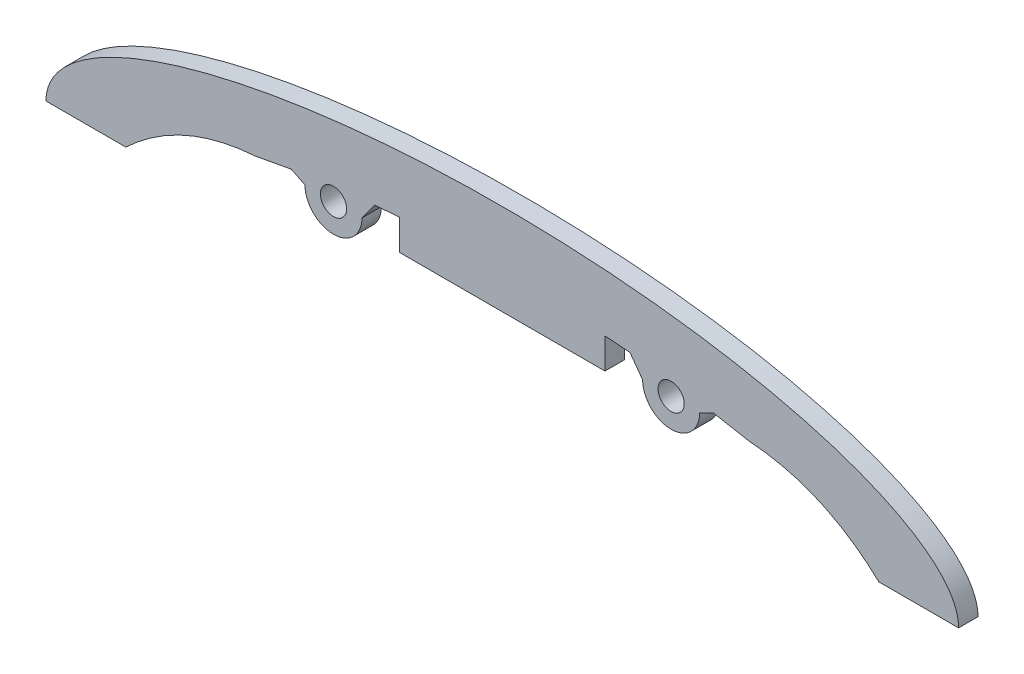
ISO-10303-21;
HEADER;
FILE_DESCRIPTION(('STEP AP214'),'2;1');
FILE_NAME('part.step','',(''),(''),'','','');
FILE_SCHEMA(('AUTOMOTIVE_DESIGN { 1 0 10303 214 1 1 1 1 }'));
ENDSEC;
DATA;
#1=APPLICATION_CONTEXT('core data for automotive mechanical design processes');
#2=APPLICATION_PROTOCOL_DEFINITION('international standard','automotive_design',2000,#1);
#3=PRODUCT_CONTEXT('',#1,'mechanical');
#4=PRODUCT('Part','Part','',(#3));
#5=PRODUCT_RELATED_PRODUCT_CATEGORY('part','',(#4));
#6=PRODUCT_DEFINITION_FORMATION('','',#4);
#7=PRODUCT_DEFINITION_CONTEXT('part definition',#1,'design');
#8=PRODUCT_DEFINITION('design','',#6,#7);
#9=PRODUCT_DEFINITION_SHAPE('','',#8);
#10=(LENGTH_UNIT() NAMED_UNIT(*) SI_UNIT(.MILLI.,.METRE.));
#11=(NAMED_UNIT(*) PLANE_ANGLE_UNIT() SI_UNIT($,.RADIAN.));
#12=(NAMED_UNIT(*) SI_UNIT($,.STERADIAN.) SOLID_ANGLE_UNIT());
#13=UNCERTAINTY_MEASURE_WITH_UNIT(LENGTH_MEASURE(1.E-05),#10,'distance_accuracy_value','');
#14=(GEOMETRIC_REPRESENTATION_CONTEXT(3) GLOBAL_UNCERTAINTY_ASSIGNED_CONTEXT((#13)) GLOBAL_UNIT_ASSIGNED_CONTEXT((#10,
#11,#12)) REPRESENTATION_CONTEXT('',''));
#15=CARTESIAN_POINT('',(0.,0.,0.));
#16=DIRECTION('',(0.,0.,1.));
#17=DIRECTION('',(1.,0.,0.));
#18=AXIS2_PLACEMENT_3D('',#15,#16,#17);
#19=CARTESIAN_POINT('',(21.6102487825062,5.,1.7));
#20=CARTESIAN_POINT('',(21.2180148029138,5.08066905141841,1.7));
#21=CARTESIAN_POINT('',(20.4394979640194,5.23436943529084,1.7));
#22=CARTESIAN_POINT('',(19.4951060891467,5.40604740015627,1.7));
#23=CARTESIAN_POINT('',(18.7420292806283,5.53528947717368,1.7));
#24=CARTESIAN_POINT('',(17.9119906435806,5.6726157972469,1.7));
#25=CARTESIAN_POINT('',(15.626961667524,6.02302536802883,1.7));
#26=CARTESIAN_POINT('',(13.0947737889869,6.32736361113546,1.7));
#27=CARTESIAN_POINT('',(10.8371870665164,6.53364725428514,1.7));
#28=CARTESIAN_POINT('',(10.1053906870872,6.59520308612822,1.7));
#29=CARTESIAN_POINT('',(9.37027735653486,6.65351582896607,1.7));
#30=CARTESIAN_POINT('',(7.93114516513906,6.75743059602858,1.7));
#31=CARTESIAN_POINT('',(4.76847668070915,6.93581519689079,1.7));
#32=CARTESIAN_POINT('',(0.,7.04357036071809,1.7));
#33=CARTESIAN_POINT('',(-4.76847668070919,6.93581519689078,1.7));
#34=CARTESIAN_POINT('',(-7.93114516513908,6.75743059602857,1.7));
#35=CARTESIAN_POINT('',(-9.37027735653483,6.65351582896607,1.7));
#36=CARTESIAN_POINT('',(-10.105390687087,6.59520308612823,1.7));
#37=CARTESIAN_POINT('',(-10.8371870665162,6.53364725428516,1.7));
#38=CARTESIAN_POINT('',(-13.0947737889867,6.32736361113549,1.7));
#39=CARTESIAN_POINT('',(-15.6269616675239,6.02302536802885,1.7));
#40=CARTESIAN_POINT('',(-17.9119906435806,5.6726157972469,1.7));
#41=CARTESIAN_POINT('',(-18.7420292806283,5.53528947717368,1.7));
#42=CARTESIAN_POINT('',(-19.4951060891467,5.40604740015626,1.7));
#43=CARTESIAN_POINT('',(-20.4394979640194,5.23436943529084,1.7));
#44=CARTESIAN_POINT('',(-21.2180148029138,5.0806690514184,1.7));
#45=CARTESIAN_POINT('',(-21.6102487825062,5.,1.7));
#46=B_SPLINE_CURVE_WITH_KNOTS('',3,(#19,#20,#21,#22,#23,#24,#25,#26,#27,#28,#29,#30,#31,#32,#33,
#34,#35,#36,#37,#38,#39,#40,#41,#42,#43,#44,#45),.UNSPECIFIED.,.F.,.F.,(4,1,1,1,1,1,1,1,1,1,1,1,
1,1,1,1,1,1,1,1,1,1,1,1,4),(-2.17175977459974,-2.13419955911194,-2.09663934362414,
-2.08415274139204,-2.06537263364814,-2.02151891264853,-1.88132786482525,-1.85159212307353,
-1.83672425219766,-1.8218563813218,-1.79212063957008,-1.72103718874611,-1.5707963267949,
-1.42055546484369,-1.34947201401971,-1.31973627226799,-1.30486840139213,-1.29000053051627,
-1.26026478876455,-1.12007374094126,-1.07622001994166,-1.05743991219776,-1.04495330996566,
-1.00739309447786,-0.969832878990053),.UNSPECIFIED.);
#47=DIRECTION('',(0.,0.,-1.));
#48=VECTOR('',#47,1.);
#49=SURFACE_OF_LINEAR_EXTRUSION('',#46,#48);
#50=CARTESIAN_POINT('',(21.6102487825062,5.,0.));
#51=CARTESIAN_POINT('',(21.2180148029138,5.08066905141841,0.));
#52=CARTESIAN_POINT('',(20.4394979640194,5.23436943529084,0.));
#53=CARTESIAN_POINT('',(19.4951060891467,5.40604740015627,0.));
#54=CARTESIAN_POINT('',(18.7420292806283,5.53528947717368,0.));
#55=CARTESIAN_POINT('',(17.9119906435806,5.6726157972469,0.));
#56=CARTESIAN_POINT('',(15.626961667524,6.02302536802883,0.));
#57=CARTESIAN_POINT('',(13.0947737889869,6.32736361113546,0.));
#58=CARTESIAN_POINT('',(10.8371870665164,6.53364725428514,0.));
#59=CARTESIAN_POINT('',(10.1053906870872,6.59520308612822,0.));
#60=CARTESIAN_POINT('',(9.37027735653486,6.65351582896607,0.));
#61=CARTESIAN_POINT('',(7.93114516513906,6.75743059602858,0.));
#62=CARTESIAN_POINT('',(4.76847668070915,6.93581519689079,0.));
#63=CARTESIAN_POINT('',(0.,7.04357036071809,0.));
#64=CARTESIAN_POINT('',(-4.76847668070919,6.93581519689078,0.));
#65=CARTESIAN_POINT('',(-7.93114516513908,6.75743059602857,0.));
#66=CARTESIAN_POINT('',(-9.37027735653483,6.65351582896607,0.));
#67=CARTESIAN_POINT('',(-10.105390687087,6.59520308612823,0.));
#68=CARTESIAN_POINT('',(-10.8371870665162,6.53364725428516,0.));
#69=CARTESIAN_POINT('',(-13.0947737889867,6.32736361113549,0.));
#70=CARTESIAN_POINT('',(-15.6269616675239,6.02302536802885,0.));
#71=CARTESIAN_POINT('',(-17.9119906435806,5.6726157972469,0.));
#72=CARTESIAN_POINT('',(-18.7420292806283,5.53528947717368,0.));
#73=CARTESIAN_POINT('',(-19.4951060891467,5.40604740015626,0.));
#74=CARTESIAN_POINT('',(-20.4394979640194,5.23436943529084,0.));
#75=CARTESIAN_POINT('',(-21.2180148029138,5.0806690514184,0.));
#76=CARTESIAN_POINT('',(-21.6102487825062,5.,0.));
#77=B_SPLINE_CURVE_WITH_KNOTS('',3,(#50,#51,#52,#53,#54,#55,#56,#57,#58,#59,#60,#61,#62,#63,#64,
#65,#66,#67,#68,#69,#70,#71,#72,#73,#74,#75,#76),.UNSPECIFIED.,.F.,.F.,(4,1,1,1,1,1,1,1,1,1,1,1,
1,1,1,1,1,1,1,1,1,1,1,1,4),(-2.17175977459974,-2.13419955911194,-2.09663934362414,
-2.08415274139204,-2.06537263364814,-2.02151891264853,-1.88132786482525,-1.85159212307353,
-1.83672425219766,-1.8218563813218,-1.79212063957008,-1.72103718874611,-1.5707963267949,
-1.42055546484369,-1.34947201401971,-1.31973627226799,-1.30486840139213,-1.29000053051627,
-1.26026478876455,-1.12007374094126,-1.07622001994166,-1.05743991219776,-1.04495330996566,
-1.00739309447786,-0.969832878990053),.UNSPECIFIED.);
#78=CARTESIAN_POINT('',(21.6102487825062,5.,0.));
#79=VERTEX_POINT('',#78);
#80=CARTESIAN_POINT('',(18.5,5.57514102727303,0.));
#81=VERTEX_POINT('',#80);
#82=EDGE_CURVE('E207',#79,#81,#77,.T.);
#83=ORIENTED_EDGE('',*,*,#82,.F.);
#84=DIRECTION('',(0.,0.,-1.));
#85=VECTOR('',#84,1.);
#86=CARTESIAN_POINT('',(21.6102487825062,5.,1.7));
#87=LINE('',#86,#85);
#88=CARTESIAN_POINT('',(21.6102487825062,5.,1.7));
#89=VERTEX_POINT('',#88);
#90=EDGE_CURVE('E11',#89,#79,#87,.T.);
#91=ORIENTED_EDGE('',*,*,#90,.F.);
#92=CARTESIAN_POINT('',(18.5,5.57514102727303,1.7));
#93=VERTEX_POINT('',#92);
#94=EDGE_CURVE('E201',#89,#93,#46,.T.);
#95=ORIENTED_EDGE('',*,*,#94,.T.);
#96=DIRECTION('',(0.,0.,-1.));
#97=VECTOR('',#96,1.);
#98=CARTESIAN_POINT('',(18.5,5.57514102727303,1.7));
#99=LINE('',#98,#97);
#100=EDGE_CURVE('E124',#93,#81,#99,.T.);
#101=ORIENTED_EDGE('',*,*,#100,.T.);
#102=EDGE_LOOP('',(#83,#91,#95,#101));
#103=FACE_BOUND('',#102,.T.);
#104=ADVANCED_FACE('F41',(#103),#49,.T.);
#105=CARTESIAN_POINT('',(21.6102487825062,5.,1.7));
#106=CARTESIAN_POINT('',(28.2034208752882,4.53862996030731,1.7));
#107=CARTESIAN_POINT('',(33.,0.,1.7));
#108=B_SPLINE_CURVE_WITH_KNOTS('',2,(#105,#106,#107),.UNSPECIFIED.,.F.,.F.,(3,3),(0.,1.),.UNSPECIFIED.);
#109=DIRECTION('',(0.,0.,-1.));
#110=VECTOR('',#109,1.);
#111=SURFACE_OF_LINEAR_EXTRUSION('',#108,#110);
#112=CARTESIAN_POINT('',(21.6102487825062,5.,0.));
#113=CARTESIAN_POINT('',(28.2034208752882,4.53862996030731,0.));
#114=CARTESIAN_POINT('',(33.,0.,0.));
#115=B_SPLINE_CURVE_WITH_KNOTS('',2,(#112,#113,#114),.UNSPECIFIED.,.F.,.F.,(3,3),(0.,1.),.UNSPECIFIED.);
#116=CARTESIAN_POINT('',(33.,0.,0.));
#117=VERTEX_POINT('',#116);
#118=EDGE_CURVE('E213',#79,#117,#115,.T.);
#119=ORIENTED_EDGE('',*,*,#118,.T.);
#120=DIRECTION('',(0.,0.,-1.));
#121=VECTOR('',#120,1.);
#122=CARTESIAN_POINT('',(33.,0.,1.7));
#123=LINE('',#122,#121);
#124=CARTESIAN_POINT('',(33.,0.,1.7));
#125=VERTEX_POINT('',#124);
#126=EDGE_CURVE('E52',#125,#117,#123,.T.);
#127=ORIENTED_EDGE('',*,*,#126,.F.);
#128=EDGE_CURVE('E456',#89,#125,#108,.T.);
#129=ORIENTED_EDGE('',*,*,#128,.F.);
#130=ORIENTED_EDGE('',*,*,#90,.T.);
#131=EDGE_LOOP('',(#119,#127,#129,#130));
#132=FACE_BOUND('',#131,.T.);
#133=ADVANCED_FACE('F43',(#132),#111,.F.);
#134=CARTESIAN_POINT('',(0.,0.,1.7));
#135=DIRECTION('',(0.,1.,0.));
#136=DIRECTION('',(-1.,0.,0.));
#137=AXIS2_PLACEMENT_3D('',#134,#135,#136);
#138=PLANE('',#137);
#139=DIRECTION('',(1.,0.,0.));
#140=VECTOR('',#139,1.);
#141=CARTESIAN_POINT('',(0.,0.,0.));
#142=LINE('',#141,#140);
#143=CARTESIAN_POINT('',(40.,0.,0.));
#144=VERTEX_POINT('',#143);
#145=EDGE_CURVE('E224',#117,#144,#142,.T.);
#146=ORIENTED_EDGE('',*,*,#145,.T.);
#147=DIRECTION('',(0.,0.,-1.));
#148=VECTOR('',#147,1.);
#149=CARTESIAN_POINT('',(40.,0.,1.7));
#150=LINE('',#149,#148);
#151=CARTESIAN_POINT('',(40.,0.,1.7));
#152=VERTEX_POINT('',#151);
#153=EDGE_CURVE('E318',#152,#144,#150,.T.);
#154=ORIENTED_EDGE('',*,*,#153,.F.);
#155=DIRECTION('',(1.,0.,0.));
#156=VECTOR('',#155,1.);
#157=CARTESIAN_POINT('',(0.,0.,1.7));
#158=LINE('',#157,#156);
#159=EDGE_CURVE('E329',#125,#152,#158,.T.);
#160=ORIENTED_EDGE('',*,*,#159,.F.);
#161=ORIENTED_EDGE('',*,*,#126,.T.);
#162=EDGE_LOOP('',(#146,#154,#160,#161));
#163=FACE_BOUND('',#162,.T.);
#164=ADVANCED_FACE('F327',(#163),#138,.F.);
#165=CARTESIAN_POINT('',(0.,0.,1.7));
#166=DIRECTION('',(0.,0.,1.));
#167=DIRECTION('',(-1.,0.,0.));
#168=AXIS2_PLACEMENT_3D('',#165,#166,#167);
#169=ELLIPSE('',#168,40.,12.);
#170=DIRECTION('',(0.,0.,-1.));
#171=VECTOR('',#170,1.);
#172=SURFACE_OF_LINEAR_EXTRUSION('',#169,#171);
#173=CARTESIAN_POINT('',(0.,0.,0.));
#174=DIRECTION('',(0.,0.,1.));
#175=DIRECTION('',(-1.,0.,0.));
#176=AXIS2_PLACEMENT_3D('',#173,#174,#175);
#177=ELLIPSE('',#176,40.,12.);
#178=CARTESIAN_POINT('',(-40.,0.,0.));
#179=VERTEX_POINT('',#178);
#180=EDGE_CURVE('E230',#144,#179,#177,.T.);
#181=ORIENTED_EDGE('',*,*,#180,.T.);
#182=DIRECTION('',(0.,0.,-1.));
#183=VECTOR('',#182,1.);
#184=CARTESIAN_POINT('',(-40.,0.,1.7));
#185=LINE('',#184,#183);
#186=CARTESIAN_POINT('',(-40.,0.,1.7));
#187=VERTEX_POINT('',#186);
#188=EDGE_CURVE('E314',#187,#179,#185,.T.);
#189=ORIENTED_EDGE('',*,*,#188,.F.);
#190=EDGE_CURVE('E349',#152,#187,#169,.T.);
#191=ORIENTED_EDGE('',*,*,#190,.F.);
#192=ORIENTED_EDGE('',*,*,#153,.T.);
#193=EDGE_LOOP('',(#181,#189,#191,#192));
#194=FACE_BOUND('',#193,.T.);
#195=ADVANCED_FACE('F338',(#194),#172,.F.);
#196=CARTESIAN_POINT('',(0.,0.,1.7));
#197=DIRECTION('',(0.,1.,0.));
#198=DIRECTION('',(-1.,0.,0.));
#199=AXIS2_PLACEMENT_3D('',#196,#197,#198);
#200=PLANE('',#199);
#201=DIRECTION('',(1.,0.,0.));
#202=VECTOR('',#201,1.);
#203=CARTESIAN_POINT('',(0.,0.,0.));
#204=LINE('',#203,#202);
#205=CARTESIAN_POINT('',(-33.,0.,0.));
#206=VERTEX_POINT('',#205);
#207=EDGE_CURVE('E233',#179,#206,#204,.T.);
#208=ORIENTED_EDGE('',*,*,#207,.T.);
#209=DIRECTION('',(0.,0.,-1.));
#210=VECTOR('',#209,1.);
#211=CARTESIAN_POINT('',(-33.,0.,1.7));
#212=LINE('',#211,#210);
#213=CARTESIAN_POINT('',(-33.,0.,1.7));
#214=VERTEX_POINT('',#213);
#215=EDGE_CURVE('E311',#214,#206,#212,.T.);
#216=ORIENTED_EDGE('',*,*,#215,.F.);
#217=DIRECTION('',(1.,0.,0.));
#218=VECTOR('',#217,1.);
#219=CARTESIAN_POINT('',(0.,0.,1.7));
#220=LINE('',#219,#218);
#221=EDGE_CURVE('E344',#187,#214,#220,.T.);
#222=ORIENTED_EDGE('',*,*,#221,.F.);
#223=ORIENTED_EDGE('',*,*,#188,.T.);
#224=EDGE_LOOP('',(#208,#216,#222,#223));
#225=FACE_BOUND('',#224,.T.);
#226=ADVANCED_FACE('F342',(#225),#200,.F.);
#227=CARTESIAN_POINT('',(-21.6102487825062,5.,1.7));
#228=CARTESIAN_POINT('',(-28.2034208752882,4.53862996030728,1.7));
#229=CARTESIAN_POINT('',(-33.,0.,1.7));
#230=B_SPLINE_CURVE_WITH_KNOTS('',2,(#227,#228,#229),.UNSPECIFIED.,.F.,.F.,(3,3),(0.,1.),.UNSPECIFIED.);
#231=DIRECTION('',(0.,0.,-1.));
#232=VECTOR('',#231,1.);
#233=SURFACE_OF_LINEAR_EXTRUSION('',#230,#232);
#234=CARTESIAN_POINT('',(-21.6102487825062,5.,0.));
#235=CARTESIAN_POINT('',(-28.2034208752882,4.53862996030728,0.));
#236=CARTESIAN_POINT('',(-33.,0.,0.));
#237=B_SPLINE_CURVE_WITH_KNOTS('',2,(#234,#235,#236),.UNSPECIFIED.,.F.,.F.,(3,3),(0.,1.),.UNSPECIFIED.);
#238=CARTESIAN_POINT('',(-21.6102487825062,5.,0.));
#239=VERTEX_POINT('',#238);
#240=EDGE_CURVE('E237',#239,#206,#237,.T.);
#241=ORIENTED_EDGE('',*,*,#240,.F.);
#242=DIRECTION('',(0.,0.,-1.));
#243=VECTOR('',#242,1.);
#244=CARTESIAN_POINT('',(-21.6102487825062,5.,1.7));
#245=LINE('',#244,#243);
#246=CARTESIAN_POINT('',(-21.6102487825062,5.,1.7));
#247=VERTEX_POINT('',#246);
#248=EDGE_CURVE('E308',#247,#239,#245,.T.);
#249=ORIENTED_EDGE('',*,*,#248,.F.);
#250=EDGE_CURVE('E348',#247,#214,#230,.T.);
#251=ORIENTED_EDGE('',*,*,#250,.T.);
#252=ORIENTED_EDGE('',*,*,#215,.T.);
#253=EDGE_LOOP('',(#241,#249,#251,#252));
#254=FACE_BOUND('',#253,.T.);
#255=ADVANCED_FACE('F368',(#254),#233,.T.);
#256=CARTESIAN_POINT('',(-18.5,5.57514102727304,0.));
#257=VERTEX_POINT('',#256);
#258=EDGE_CURVE('E216',#257,#239,#77,.T.);
#259=ORIENTED_EDGE('',*,*,#258,.F.);
#260=DIRECTION('',(0.,0.,-1.));
#261=VECTOR('',#260,1.);
#262=CARTESIAN_POINT('',(-18.5,5.57514102727304,1.7));
#263=LINE('',#262,#261);
#264=CARTESIAN_POINT('',(-18.5,5.57514102727304,1.7));
#265=VERTEX_POINT('',#264);
#266=EDGE_CURVE('E305',#265,#257,#263,.T.);
#267=ORIENTED_EDGE('',*,*,#266,.F.);
#268=EDGE_CURVE('E353',#265,#247,#46,.T.);
#269=ORIENTED_EDGE('',*,*,#268,.T.);
#270=ORIENTED_EDGE('',*,*,#248,.T.);
#271=EDGE_LOOP('',(#259,#267,#269,#270));
#272=FACE_BOUND('',#271,.T.);
#273=ADVANCED_FACE('F372',(#272),#49,.T.);
#274=CARTESIAN_POINT('',(-1.43433888847908,-2.89120494929168,1.7));
#275=DIRECTION('',(-0.44441946457456,-0.895818809529729,0.));
#276=DIRECTION('',(0.895818809529729,-0.44441946457456,0.));
#277=AXIS2_PLACEMENT_3D('',#274,#275,#276);
#278=PLANE('',#277);
#279=DIRECTION('',(-0.895818809529729,0.44441946457456,0.));
#280=VECTOR('',#279,1.);
#281=CARTESIAN_POINT('',(-1.43433888847908,-2.89120494929168,0.));
#282=LINE('',#281,#280);
#283=CARTESIAN_POINT('',(-17.3,4.9798159996936,0.));
#284=VERTEX_POINT('',#283);
#285=EDGE_CURVE('E243',#284,#257,#282,.T.);
#286=ORIENTED_EDGE('',*,*,#285,.F.);
#287=DIRECTION('',(0.,0.,-1.));
#288=VECTOR('',#287,1.);
#289=CARTESIAN_POINT('',(-17.3,4.9798159996936,1.7));
#290=LINE('',#289,#288);
#291=CARTESIAN_POINT('',(-17.3,4.9798159996936,1.7));
#292=VERTEX_POINT('',#291);
#293=EDGE_CURVE('E302',#292,#284,#290,.T.);
#294=ORIENTED_EDGE('',*,*,#293,.F.);
#295=DIRECTION('',(-0.895818809529729,0.44441946457456,0.));
#296=VECTOR('',#295,1.);
#297=CARTESIAN_POINT('',(-1.43433888847908,-2.89120494929168,1.7));
#298=LINE('',#297,#296);
#299=EDGE_CURVE('E362',#292,#265,#298,.T.);
#300=ORIENTED_EDGE('',*,*,#299,.T.);
#301=ORIENTED_EDGE('',*,*,#266,.T.);
#302=EDGE_LOOP('',(#286,#294,#300,#301));
#303=FACE_BOUND('',#302,.T.);
#304=ADVANCED_FACE('F374',(#303),#278,.T.);
#305=CARTESIAN_POINT('',(-14.8,4.9798159996936,1.7));
#306=DIRECTION('',(0.,0.,-1.));
#307=DIRECTION('',(-1.,0.,0.));
#308=AXIS2_PLACEMENT_3D('',#305,#306,#307);
#309=CYLINDRICAL_SURFACE('',#308,2.5);
#310=CARTESIAN_POINT('',(-14.8,4.9798159996936,0.));
#311=DIRECTION('',(0.,0.,1.));
#312=DIRECTION('',(1.,0.,0.));
#313=AXIS2_PLACEMENT_3D('',#310,#311,#312);
#314=CIRCLE('',#313,2.5);
#315=CARTESIAN_POINT('',(-12.3,4.9798159996936,0.));
#316=VERTEX_POINT('',#315);
#317=EDGE_CURVE('E250',#284,#316,#314,.T.);
#318=ORIENTED_EDGE('',*,*,#317,.T.);
#319=DIRECTION('',(0.,0.,-1.));
#320=VECTOR('',#319,1.);
#321=CARTESIAN_POINT('',(-12.3,4.9798159996936,1.7));
#322=LINE('',#321,#320);
#323=CARTESIAN_POINT('',(-12.3,4.9798159996936,1.7));
#324=VERTEX_POINT('',#323);
#325=EDGE_CURVE('E298',#324,#316,#322,.T.);
#326=ORIENTED_EDGE('',*,*,#325,.F.);
#327=CARTESIAN_POINT('',(-14.8,4.9798159996936,1.7));
#328=DIRECTION('',(0.,0.,1.));
#329=DIRECTION('',(1.,0.,0.));
#330=AXIS2_PLACEMENT_3D('',#327,#328,#329);
#331=CIRCLE('',#330,2.5);
#332=EDGE_CURVE('E444',#292,#324,#331,.T.);
#333=ORIENTED_EDGE('',*,*,#332,.F.);
#334=ORIENTED_EDGE('',*,*,#293,.T.);
#335=EDGE_LOOP('',(#318,#326,#333,#334));
#336=FACE_BOUND('',#335,.T.);
#337=ADVANCED_FACE('F413',(#336),#309,.T.);
#338=CARTESIAN_POINT('',(-10.4382474151856,7.55281980570069,1.7));
#339=DIRECTION('',(-0.810160006857971,0.586208805194781,0.));
#340=DIRECTION('',(-0.586208805194781,-0.810160006857971,0.));
#341=AXIS2_PLACEMENT_3D('',#338,#339,#340);
#342=PLANE('',#341);
#343=DIRECTION('',(0.586208805194781,0.810160006857971,0.));
#344=VECTOR('',#343,1.);
#345=CARTESIAN_POINT('',(-10.4382474151856,7.55281980570069,0.));
#346=LINE('',#345,#344);
#347=CARTESIAN_POINT('',(-11.1999999999997,6.50005247455842,0.));
#348=VERTEX_POINT('',#347);
#349=EDGE_CURVE('E253',#316,#348,#346,.T.);
#350=ORIENTED_EDGE('',*,*,#349,.T.);
#351=DIRECTION('',(0.,0.,-1.));
#352=VECTOR('',#351,1.);
#353=CARTESIAN_POINT('',(-11.1999999999997,6.50005247455842,1.7));
#354=LINE('',#353,#352);
#355=CARTESIAN_POINT('',(-11.1999999999997,6.50005247455842,1.7));
#356=VERTEX_POINT('',#355);
#357=EDGE_CURVE('E295',#356,#348,#354,.T.);
#358=ORIENTED_EDGE('',*,*,#357,.F.);
#359=DIRECTION('',(0.586208805194781,0.810160006857971,0.));
#360=VECTOR('',#359,1.);
#361=CARTESIAN_POINT('',(-10.4382474151856,7.55281980570069,1.7));
#362=LINE('',#361,#360);
#363=EDGE_CURVE('E441',#324,#356,#362,.T.);
#364=ORIENTED_EDGE('',*,*,#363,.F.);
#365=ORIENTED_EDGE('',*,*,#325,.T.);
#366=EDGE_LOOP('',(#350,#358,#364,#365));
#367=FACE_BOUND('',#366,.T.);
#368=ADVANCED_FACE('F405',(#367),#342,.F.);
#369=CARTESIAN_POINT('',(-9.,6.6798159996936,0.));
#370=VERTEX_POINT('',#369);
#371=EDGE_CURVE('E257',#370,#348,#77,.T.);
#372=ORIENTED_EDGE('',*,*,#371,.F.);
#373=DIRECTION('',(0.,0.,-1.));
#374=VECTOR('',#373,1.);
#375=CARTESIAN_POINT('',(-9.,6.6798159996936,1.7));
#376=LINE('',#375,#374);
#377=CARTESIAN_POINT('',(-9.,6.6798159996936,1.7));
#378=VERTEX_POINT('',#377);
#379=EDGE_CURVE('E292',#378,#370,#376,.T.);
#380=ORIENTED_EDGE('',*,*,#379,.F.);
#381=EDGE_CURVE('E200',#378,#356,#46,.T.);
#382=ORIENTED_EDGE('',*,*,#381,.T.);
#383=ORIENTED_EDGE('',*,*,#357,.T.);
#384=EDGE_LOOP('',(#372,#380,#382,#383));
#385=FACE_BOUND('',#384,.T.);
#386=ADVANCED_FACE('F392',(#385),#49,.T.);
#387=CARTESIAN_POINT('',(-8.99999999999999,0.,1.7));
#388=DIRECTION('',(1.,0.,0.));
#389=DIRECTION('',(0.,1.,0.));
#390=AXIS2_PLACEMENT_3D('',#387,#388,#389);
#391=PLANE('',#390);
#392=DIRECTION('',(0.,-1.,0.));
#393=VECTOR('',#392,1.);
#394=CARTESIAN_POINT('',(-8.99999999999999,0.,0.));
#395=LINE('',#394,#393);
#396=CARTESIAN_POINT('',(-9.,4.,0.));
#397=VERTEX_POINT('',#396);
#398=EDGE_CURVE('E258',#370,#397,#395,.T.);
#399=ORIENTED_EDGE('',*,*,#398,.T.);
#400=DIRECTION('',(0.,0.,-1.));
#401=VECTOR('',#400,1.);
#402=CARTESIAN_POINT('',(-9.,4.,1.7));
#403=LINE('',#402,#401);
#404=CARTESIAN_POINT('',(-9.,4.,1.7));
#405=VERTEX_POINT('',#404);
#406=EDGE_CURVE('E288',#405,#397,#403,.T.);
#407=ORIENTED_EDGE('',*,*,#406,.F.);
#408=DIRECTION('',(0.,-1.,0.));
#409=VECTOR('',#408,1.);
#410=CARTESIAN_POINT('',(-8.99999999999999,0.,1.7));
#411=LINE('',#410,#409);
#412=EDGE_CURVE('E435',#378,#405,#411,.T.);
#413=ORIENTED_EDGE('',*,*,#412,.F.);
#414=ORIENTED_EDGE('',*,*,#379,.T.);
#415=EDGE_LOOP('',(#399,#407,#413,#414));
#416=FACE_BOUND('',#415,.T.);
#417=ADVANCED_FACE('F404',(#416),#391,.F.);
#418=CARTESIAN_POINT('',(0.,4.,1.7));
#419=DIRECTION('',(0.,1.,0.));
#420=DIRECTION('',(0.,0.,1.));
#421=AXIS2_PLACEMENT_3D('',#418,#419,#420);
#422=PLANE('',#421);
#423=DIRECTION('',(1.,0.,0.));
#424=VECTOR('',#423,1.);
#425=CARTESIAN_POINT('',(0.,4.,0.));
#426=LINE('',#425,#424);
#427=CARTESIAN_POINT('',(9.,4.,0.));
#428=VERTEX_POINT('',#427);
#429=EDGE_CURVE('E261',#397,#428,#426,.T.);
#430=ORIENTED_EDGE('',*,*,#429,.T.);
#431=DIRECTION('',(0.,0.,-1.));
#432=VECTOR('',#431,1.);
#433=CARTESIAN_POINT('',(9.,4.,1.7));
#434=LINE('',#433,#432);
#435=CARTESIAN_POINT('',(9.,4.,1.7));
#436=VERTEX_POINT('',#435);
#437=EDGE_CURVE('E285',#436,#428,#434,.T.);
#438=ORIENTED_EDGE('',*,*,#437,.F.);
#439=DIRECTION('',(1.,0.,0.));
#440=VECTOR('',#439,1.);
#441=CARTESIAN_POINT('',(0.,4.,1.7));
#442=LINE('',#441,#440);
#443=EDGE_CURVE('E438',#405,#436,#442,.T.);
#444=ORIENTED_EDGE('',*,*,#443,.F.);
#445=ORIENTED_EDGE('',*,*,#406,.T.);
#446=EDGE_LOOP('',(#430,#438,#444,#445));
#447=FACE_BOUND('',#446,.T.);
#448=ADVANCED_FACE('F400',(#447),#422,.F.);
#449=CARTESIAN_POINT('',(9.00000000000001,0.,1.7));
#450=DIRECTION('',(1.,0.,0.));
#451=DIRECTION('',(0.,1.,0.));
#452=AXIS2_PLACEMENT_3D('',#449,#450,#451);
#453=PLANE('',#452);
#454=DIRECTION('',(0.,-1.,0.));
#455=VECTOR('',#454,1.);
#456=CARTESIAN_POINT('',(9.00000000000001,0.,0.));
#457=LINE('',#456,#455);
#458=CARTESIAN_POINT('',(8.99999999999998,6.6798159996936,0.));
#459=VERTEX_POINT('',#458);
#460=EDGE_CURVE('E265',#459,#428,#457,.T.);
#461=ORIENTED_EDGE('',*,*,#460,.F.);
#462=DIRECTION('',(0.,0.,-1.));
#463=VECTOR('',#462,1.);
#464=CARTESIAN_POINT('',(8.99999999999998,6.6798159996936,1.7));
#465=LINE('',#464,#463);
#466=CARTESIAN_POINT('',(8.99999999999998,6.6798159996936,1.7));
#467=VERTEX_POINT('',#466);
#468=EDGE_CURVE('E282',#467,#459,#465,.T.);
#469=ORIENTED_EDGE('',*,*,#468,.F.);
#470=DIRECTION('',(0.,-1.,0.));
#471=VECTOR('',#470,1.);
#472=CARTESIAN_POINT('',(9.00000000000001,0.,1.7));
#473=LINE('',#472,#471);
#474=EDGE_CURVE('E198',#467,#436,#473,.T.);
#475=ORIENTED_EDGE('',*,*,#474,.T.);
#476=ORIENTED_EDGE('',*,*,#437,.T.);
#477=EDGE_LOOP('',(#461,#469,#475,#476));
#478=FACE_BOUND('',#477,.T.);
#479=ADVANCED_FACE('F394',(#478),#453,.T.);
#480=CARTESIAN_POINT('',(11.2,6.50005247455841,0.));
#481=VERTEX_POINT('',#480);
#482=EDGE_CURVE('E215',#481,#459,#77,.T.);
#483=ORIENTED_EDGE('',*,*,#482,.F.);
#484=DIRECTION('',(0.,0.,-1.));
#485=VECTOR('',#484,1.);
#486=CARTESIAN_POINT('',(11.2,6.50005247455841,1.7));
#487=LINE('',#486,#485);
#488=CARTESIAN_POINT('',(11.2,6.50005247455841,1.7));
#489=VERTEX_POINT('',#488);
#490=EDGE_CURVE('E183',#489,#481,#487,.T.);
#491=ORIENTED_EDGE('',*,*,#490,.F.);
#492=EDGE_CURVE('E194',#489,#467,#46,.T.);
#493=ORIENTED_EDGE('',*,*,#492,.T.);
#494=ORIENTED_EDGE('',*,*,#468,.T.);
#495=EDGE_LOOP('',(#483,#491,#493,#494));
#496=FACE_BOUND('',#495,.T.);
#497=ADVANCED_FACE('F385',(#496),#49,.T.);
#498=CARTESIAN_POINT('',(10.4382474151871,7.55281980569946,1.7));
#499=DIRECTION('',(-0.810160006858055,-0.586208805194665,0.));
#500=DIRECTION('',(0.586208805194665,-0.810160006858055,0.));
#501=AXIS2_PLACEMENT_3D('',#498,#499,#500);
#502=PLANE('',#501);
#503=DIRECTION('',(-0.586208805194665,0.810160006858055,0.));
#504=VECTOR('',#503,1.);
#505=CARTESIAN_POINT('',(10.4382474151871,7.55281980569946,0.));
#506=LINE('',#505,#504);
#507=CARTESIAN_POINT('',(12.3,4.9798159996936,0.));
#508=VERTEX_POINT('',#507);
#509=EDGE_CURVE('E181',#508,#481,#506,.T.);
#510=ORIENTED_EDGE('',*,*,#509,.F.);
#511=DIRECTION('',(0.,0.,-1.));
#512=VECTOR('',#511,1.);
#513=CARTESIAN_POINT('',(12.3,4.9798159996936,1.7));
#514=LINE('',#513,#512);
#515=CARTESIAN_POINT('',(12.3,4.9798159996936,1.7));
#516=VERTEX_POINT('',#515);
#517=EDGE_CURVE('E175',#516,#508,#514,.T.);
#518=ORIENTED_EDGE('',*,*,#517,.F.);
#519=DIRECTION('',(-0.586208805194665,0.810160006858055,0.));
#520=VECTOR('',#519,1.);
#521=CARTESIAN_POINT('',(10.4382474151871,7.55281980569946,1.7));
#522=LINE('',#521,#520);
#523=EDGE_CURVE('E179',#516,#489,#522,.T.);
#524=ORIENTED_EDGE('',*,*,#523,.T.);
#525=ORIENTED_EDGE('',*,*,#490,.T.);
#526=EDGE_LOOP('',(#510,#518,#524,#525));
#527=FACE_BOUND('',#526,.T.);
#528=ADVANCED_FACE('F177',(#527),#502,.T.);
#529=CARTESIAN_POINT('',(14.8,4.9798159996936,1.7));
#530=DIRECTION('',(0.,0.,-1.));
#531=DIRECTION('',(-1.,0.,0.));
#532=AXIS2_PLACEMENT_3D('',#529,#530,#531);
#533=CYLINDRICAL_SURFACE('',#532,2.5);
#534=CARTESIAN_POINT('',(14.8,4.9798159996936,0.));
#535=DIRECTION('',(0.,0.,1.));
#536=DIRECTION('',(1.,0.,0.));
#537=AXIS2_PLACEMENT_3D('',#534,#535,#536);
#538=CIRCLE('',#537,2.5);
#539=CARTESIAN_POINT('',(17.3,4.9798159996936,0.));
#540=VERTEX_POINT('',#539);
#541=EDGE_CURVE('E117',#508,#540,#538,.T.);
#542=ORIENTED_EDGE('',*,*,#541,.T.);
#543=DIRECTION('',(0.,0.,-1.));
#544=VECTOR('',#543,1.);
#545=CARTESIAN_POINT('',(17.3,4.9798159996936,1.7));
#546=LINE('',#545,#544);
#547=CARTESIAN_POINT('',(17.3,4.9798159996936,1.7));
#548=VERTEX_POINT('',#547);
#549=EDGE_CURVE('E184',#548,#540,#546,.T.);
#550=ORIENTED_EDGE('',*,*,#549,.F.);
#551=CARTESIAN_POINT('',(14.8,4.9798159996936,1.7));
#552=DIRECTION('',(0.,0.,1.));
#553=DIRECTION('',(1.,0.,0.));
#554=AXIS2_PLACEMENT_3D('',#551,#552,#553);
#555=CIRCLE('',#554,2.5);
#556=EDGE_CURVE('E186',#516,#548,#555,.T.);
#557=ORIENTED_EDGE('',*,*,#556,.F.);
#558=ORIENTED_EDGE('',*,*,#517,.T.);
#559=EDGE_LOOP('',(#542,#550,#557,#558));
#560=FACE_BOUND('',#559,.T.);
#561=ADVANCED_FACE('F187',(#560),#533,.T.);
#562=CARTESIAN_POINT('',(1.43433888847901,-2.89120494929158,1.7));
#563=DIRECTION('',(-0.444419464574554,0.895818809529732,0.));
#564=DIRECTION('',(-0.895818809529732,-0.444419464574554,0.));
#565=AXIS2_PLACEMENT_3D('',#562,#563,#564);
#566=PLANE('',#565);
#567=DIRECTION('',(0.895818809529732,0.444419464574554,0.));
#568=VECTOR('',#567,1.);
#569=CARTESIAN_POINT('',(1.43433888847901,-2.89120494929158,0.));
#570=LINE('',#569,#568);
#571=EDGE_CURVE('E273',#540,#81,#570,.T.);
#572=ORIENTED_EDGE('',*,*,#571,.T.);
#573=ORIENTED_EDGE('',*,*,#100,.F.);
#574=DIRECTION('',(0.895818809529732,0.444419464574554,0.));
#575=VECTOR('',#574,1.);
#576=CARTESIAN_POINT('',(1.43433888847901,-2.89120494929158,1.7));
#577=LINE('',#576,#575);
#578=EDGE_CURVE('E60',#548,#93,#577,.T.);
#579=ORIENTED_EDGE('',*,*,#578,.F.);
#580=ORIENTED_EDGE('',*,*,#549,.T.);
#581=EDGE_LOOP('',(#572,#573,#579,#580));
#582=FACE_BOUND('',#581,.T.);
#583=ADVANCED_FACE('F512',(#582),#566,.F.);
#584=CARTESIAN_POINT('',(0.,0.,1.7));
#585=DIRECTION('',(0.,0.,1.));
#586=DIRECTION('',(1.,0.,0.));
#587=AXIS2_PLACEMENT_3D('',#584,#585,#586);
#588=PLANE('',#587);
#589=CARTESIAN_POINT('',(-14.8,4.9798159996936,1.7));
#590=DIRECTION('',(0.,0.,1.));
#591=DIRECTION('',(1.,0.,0.));
#592=AXIS2_PLACEMENT_3D('',#589,#590,#591);
#593=CIRCLE('',#592,1.15);
#594=CARTESIAN_POINT('',(-13.65,4.9798159996936,1.7));
#595=VERTEX_POINT('',#594);
#596=EDGE_CURVE('E572',#595,#595,#593,.T.);
#597=ORIENTED_EDGE('',*,*,#596,.F.);
#598=EDGE_LOOP('',(#597));
#599=FACE_BOUND('',#598,.T.);
#600=CARTESIAN_POINT('',(14.8,4.9798159996936,1.7));
#601=DIRECTION('',(0.,0.,1.));
#602=DIRECTION('',(1.,0.,0.));
#603=AXIS2_PLACEMENT_3D('',#600,#601,#602);
#604=CIRCLE('',#603,1.15);
#605=CARTESIAN_POINT('',(15.95,4.9798159996936,1.7));
#606=VERTEX_POINT('',#605);
#607=EDGE_CURVE('E580',#606,#606,#604,.T.);
#608=ORIENTED_EDGE('',*,*,#607,.F.);
#609=EDGE_LOOP('',(#608));
#610=FACE_BOUND('',#609,.T.);
#611=ORIENTED_EDGE('',*,*,#94,.F.);
#612=ORIENTED_EDGE('',*,*,#128,.T.);
#613=ORIENTED_EDGE('',*,*,#159,.T.);
#614=ORIENTED_EDGE('',*,*,#190,.T.);
#615=ORIENTED_EDGE('',*,*,#221,.T.);
#616=ORIENTED_EDGE('',*,*,#250,.F.);
#617=ORIENTED_EDGE('',*,*,#268,.F.);
#618=ORIENTED_EDGE('',*,*,#299,.F.);
#619=ORIENTED_EDGE('',*,*,#332,.T.);
#620=ORIENTED_EDGE('',*,*,#363,.T.);
#621=ORIENTED_EDGE('',*,*,#381,.F.);
#622=ORIENTED_EDGE('',*,*,#412,.T.);
#623=ORIENTED_EDGE('',*,*,#443,.T.);
#624=ORIENTED_EDGE('',*,*,#474,.F.);
#625=ORIENTED_EDGE('',*,*,#492,.F.);
#626=ORIENTED_EDGE('',*,*,#523,.F.);
#627=ORIENTED_EDGE('',*,*,#556,.T.);
#628=ORIENTED_EDGE('',*,*,#578,.T.);
#629=EDGE_LOOP('',(#611,#612,#613,#614,#615,#616,#617,#618,#619,#620,#621,#622,#623,#624,#625,
#626,#627,#628));
#630=FACE_BOUND('',#629,.T.);
#631=ADVANCED_FACE('F191',(#599,#610,#630),#588,.T.);
#632=CARTESIAN_POINT('',(0.,0.,0.));
#633=DIRECTION('',(0.,0.,1.));
#634=DIRECTION('',(1.,0.,0.));
#635=AXIS2_PLACEMENT_3D('',#632,#633,#634);
#636=PLANE('',#635);
#637=CARTESIAN_POINT('',(-14.8,4.9798159996936,0.));
#638=DIRECTION('',(0.,0.,1.));
#639=DIRECTION('',(1.,0.,0.));
#640=AXIS2_PLACEMENT_3D('',#637,#638,#639);
#641=CIRCLE('',#640,1.15);
#642=CARTESIAN_POINT('',(-13.65,4.9798159996936,0.));
#643=VERTEX_POINT('',#642);
#644=EDGE_CURVE('E214',#643,#643,#641,.T.);
#645=ORIENTED_EDGE('',*,*,#644,.T.);
#646=EDGE_LOOP('',(#645));
#647=FACE_BOUND('',#646,.T.);
#648=CARTESIAN_POINT('',(14.8,4.9798159996936,0.));
#649=DIRECTION('',(0.,0.,1.));
#650=DIRECTION('',(1.,0.,0.));
#651=AXIS2_PLACEMENT_3D('',#648,#649,#650);
#652=CIRCLE('',#651,1.15);
#653=CARTESIAN_POINT('',(15.95,4.9798159996936,0.));
#654=VERTEX_POINT('',#653);
#655=EDGE_CURVE('E574',#654,#654,#652,.T.);
#656=ORIENTED_EDGE('',*,*,#655,.T.);
#657=EDGE_LOOP('',(#656));
#658=FACE_BOUND('',#657,.T.);
#659=ORIENTED_EDGE('',*,*,#82,.T.);
#660=ORIENTED_EDGE('',*,*,#571,.F.);
#661=ORIENTED_EDGE('',*,*,#541,.F.);
#662=ORIENTED_EDGE('',*,*,#509,.T.);
#663=ORIENTED_EDGE('',*,*,#482,.T.);
#664=ORIENTED_EDGE('',*,*,#460,.T.);
#665=ORIENTED_EDGE('',*,*,#429,.F.);
#666=ORIENTED_EDGE('',*,*,#398,.F.);
#667=ORIENTED_EDGE('',*,*,#371,.T.);
#668=ORIENTED_EDGE('',*,*,#349,.F.);
#669=ORIENTED_EDGE('',*,*,#317,.F.);
#670=ORIENTED_EDGE('',*,*,#285,.T.);
#671=ORIENTED_EDGE('',*,*,#258,.T.);
#672=ORIENTED_EDGE('',*,*,#240,.T.);
#673=ORIENTED_EDGE('',*,*,#207,.F.);
#674=ORIENTED_EDGE('',*,*,#180,.F.);
#675=ORIENTED_EDGE('',*,*,#145,.F.);
#676=ORIENTED_EDGE('',*,*,#118,.F.);
#677=EDGE_LOOP('',(#659,#660,#661,#662,#663,#664,#665,#666,#667,#668,#669,#670,#671,#672,#673,
#674,#675,#676));
#678=FACE_BOUND('',#677,.T.);
#679=ADVANCED_FACE('F334',(#647,#658,#678),#636,.F.);
#680=CARTESIAN_POINT('',(14.8,4.9798159996936,0.));
#681=DIRECTION('',(0.,0.,1.));
#682=DIRECTION('',(1.,0.,0.));
#683=AXIS2_PLACEMENT_3D('',#680,#681,#682);
#684=CYLINDRICAL_SURFACE('',#683,1.15);
#685=ORIENTED_EDGE('',*,*,#655,.F.);
#686=EDGE_LOOP('',(#685));
#687=FACE_BOUND('',#686,.T.);
#688=ORIENTED_EDGE('',*,*,#607,.T.);
#689=EDGE_LOOP('',(#688));
#690=FACE_BOUND('',#689,.T.);
#691=ADVANCED_FACE('F542',(#687,#690),#684,.F.);
#692=CARTESIAN_POINT('',(-14.8,4.9798159996936,0.));
#693=DIRECTION('',(0.,0.,1.));
#694=DIRECTION('',(1.,0.,0.));
#695=AXIS2_PLACEMENT_3D('',#692,#693,#694);
#696=CYLINDRICAL_SURFACE('',#695,1.15);
#697=ORIENTED_EDGE('',*,*,#644,.F.);
#698=EDGE_LOOP('',(#697));
#699=FACE_BOUND('',#698,.T.);
#700=ORIENTED_EDGE('',*,*,#596,.T.);
#701=EDGE_LOOP('',(#700));
#702=FACE_BOUND('',#701,.T.);
#703=ADVANCED_FACE('F553',(#699,#702),#696,.F.);
#704=CLOSED_SHELL('',(#104,#133,#164,#195,#226,#255,#273,#304,#337,#368,#386,#417,#448,#479,
#497,#528,#561,#583,#631,#679,#691,#703));
#705=MANIFOLD_SOLID_BREP('B2',#704);
#706=ADVANCED_BREP_SHAPE_REPRESENTATION('',(#18,#705),#14);
#707=SHAPE_DEFINITION_REPRESENTATION(#9,#706);
ENDSEC;
END-ISO-10303-21;
